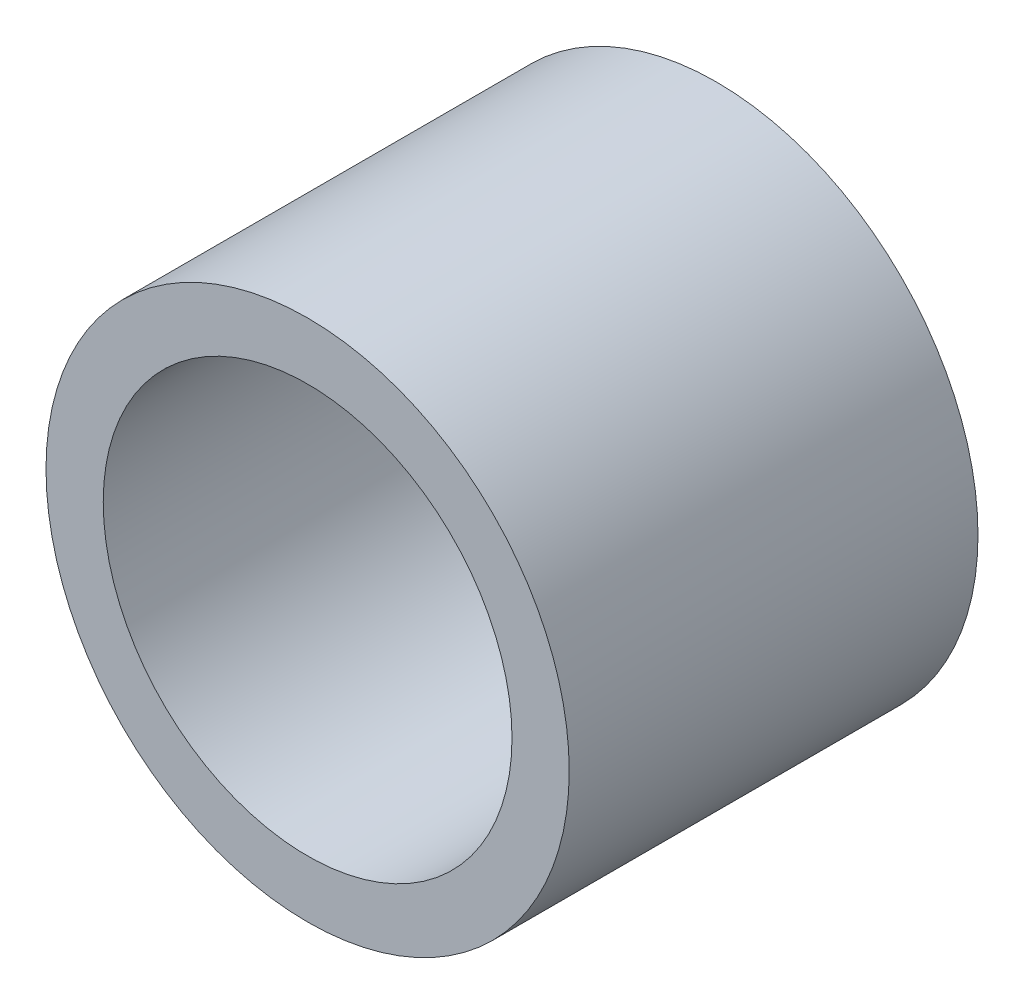
ISO-10303-21;
HEADER;
FILE_DESCRIPTION(('STEP AP214'),'2;1');
FILE_NAME('part.step','',(''),(''),'','','');
FILE_SCHEMA(('AUTOMOTIVE_DESIGN { 1 0 10303 214 1 1 1 1 }'));
ENDSEC;
DATA;
#1=APPLICATION_CONTEXT('core data for automotive mechanical design processes');
#2=APPLICATION_PROTOCOL_DEFINITION('international standard','automotive_design',2000,#1);
#3=PRODUCT_CONTEXT('',#1,'mechanical');
#4=PRODUCT('Part','Part','',(#3));
#5=PRODUCT_RELATED_PRODUCT_CATEGORY('part','',(#4));
#6=PRODUCT_DEFINITION_FORMATION('','',#4);
#7=PRODUCT_DEFINITION_CONTEXT('part definition',#1,'design');
#8=PRODUCT_DEFINITION('design','',#6,#7);
#9=PRODUCT_DEFINITION_SHAPE('','',#8);
#10=(LENGTH_UNIT() NAMED_UNIT(*) SI_UNIT(.MILLI.,.METRE.));
#11=(NAMED_UNIT(*) PLANE_ANGLE_UNIT() SI_UNIT($,.RADIAN.));
#12=(NAMED_UNIT(*) SI_UNIT($,.STERADIAN.) SOLID_ANGLE_UNIT());
#13=UNCERTAINTY_MEASURE_WITH_UNIT(LENGTH_MEASURE(1.E-05),#10,'distance_accuracy_value','');
#14=(GEOMETRIC_REPRESENTATION_CONTEXT(3) GLOBAL_UNCERTAINTY_ASSIGNED_CONTEXT((#13)) GLOBAL_UNIT_ASSIGNED_CONTEXT((#10,
#11,#12)) REPRESENTATION_CONTEXT('',''));
#15=CARTESIAN_POINT('',(0.,0.,0.));
#16=DIRECTION('',(0.,0.,1.));
#17=DIRECTION('',(1.,0.,0.));
#18=AXIS2_PLACEMENT_3D('',#15,#16,#17);
#19=CARTESIAN_POINT('',(0.,0.,6.35));
#20=DIRECTION('',(0.,0.,1.));
#21=DIRECTION('',(1.,0.,0.));
#22=AXIS2_PLACEMENT_3D('',#19,#20,#21);
#23=PLANE('',#22);
#24=CARTESIAN_POINT('',(0.,0.,6.35));
#25=DIRECTION('',(0.,0.,1.));
#26=DIRECTION('',(1.,0.,0.));
#27=AXIS2_PLACEMENT_3D('',#24,#25,#26);
#28=CIRCLE('',#27,4.064);
#29=CARTESIAN_POINT('',(4.064,0.,6.35));
#30=VERTEX_POINT('',#29);
#31=EDGE_CURVE('E10',#30,#30,#28,.T.);
#32=ORIENTED_EDGE('',*,*,#31,.T.);
#33=EDGE_LOOP('',(#32));
#34=FACE_BOUND('',#33,.T.);
#35=CARTESIAN_POINT('',(0.,0.,6.35));
#36=DIRECTION('',(0.,0.,1.));
#37=DIRECTION('',(1.,0.,0.));
#38=AXIS2_PLACEMENT_3D('',#35,#36,#37);
#39=CIRCLE('',#38,3.175);
#40=CARTESIAN_POINT('',(3.175,0.,6.35));
#41=VERTEX_POINT('',#40);
#42=EDGE_CURVE('E40',#41,#41,#39,.T.);
#43=ORIENTED_EDGE('',*,*,#42,.F.);
#44=EDGE_LOOP('',(#43));
#45=FACE_BOUND('',#44,.T.);
#46=ADVANCED_FACE('F29',(#34,#45),#23,.T.);
#47=CARTESIAN_POINT('',(0.,0.,0.));
#48=DIRECTION('',(0.,0.,1.));
#49=DIRECTION('',(1.,0.,0.));
#50=AXIS2_PLACEMENT_3D('',#47,#48,#49);
#51=PLANE('',#50);
#52=CARTESIAN_POINT('',(0.,0.,0.));
#53=DIRECTION('',(0.,0.,1.));
#54=DIRECTION('',(1.,0.,0.));
#55=AXIS2_PLACEMENT_3D('',#52,#53,#54);
#56=CIRCLE('',#55,4.064);
#57=CARTESIAN_POINT('',(4.064,0.,0.));
#58=VERTEX_POINT('',#57);
#59=EDGE_CURVE('E33',#58,#58,#56,.T.);
#60=ORIENTED_EDGE('',*,*,#59,.F.);
#61=EDGE_LOOP('',(#60));
#62=FACE_BOUND('',#61,.T.);
#63=CARTESIAN_POINT('',(0.,0.,0.));
#64=DIRECTION('',(0.,0.,1.));
#65=DIRECTION('',(1.,0.,0.));
#66=AXIS2_PLACEMENT_3D('',#63,#64,#65);
#67=CIRCLE('',#66,3.175);
#68=CARTESIAN_POINT('',(3.175,0.,0.));
#69=VERTEX_POINT('',#68);
#70=EDGE_CURVE('E42',#69,#69,#67,.T.);
#71=ORIENTED_EDGE('',*,*,#70,.T.);
#72=EDGE_LOOP('',(#71));
#73=FACE_BOUND('',#72,.T.);
#74=ADVANCED_FACE('F52',(#62,#73),#51,.F.);
#75=CARTESIAN_POINT('',(0.,0.,6.35));
#76=DIRECTION('',(0.,0.,-1.));
#77=DIRECTION('',(-1.,0.,0.));
#78=AXIS2_PLACEMENT_3D('',#75,#76,#77);
#79=CYLINDRICAL_SURFACE('',#78,4.064);
#80=ORIENTED_EDGE('',*,*,#31,.F.);
#81=EDGE_LOOP('',(#80));
#82=FACE_BOUND('',#81,.T.);
#83=ORIENTED_EDGE('',*,*,#59,.T.);
#84=EDGE_LOOP('',(#83));
#85=FACE_BOUND('',#84,.T.);
#86=ADVANCED_FACE('F31',(#82,#85),#79,.T.);
#87=CARTESIAN_POINT('',(0.,0.,6.35));
#88=DIRECTION('',(0.,0.,-1.));
#89=DIRECTION('',(-1.,0.,0.));
#90=AXIS2_PLACEMENT_3D('',#87,#88,#89);
#91=CYLINDRICAL_SURFACE('',#90,3.175);
#92=ORIENTED_EDGE('',*,*,#42,.T.);
#93=EDGE_LOOP('',(#92));
#94=FACE_BOUND('',#93,.T.);
#95=ORIENTED_EDGE('',*,*,#70,.F.);
#96=EDGE_LOOP('',(#95));
#97=FACE_BOUND('',#96,.T.);
#98=ADVANCED_FACE('F48',(#94,#97),#91,.F.);
#99=CLOSED_SHELL('',(#46,#74,#86,#98));
#100=MANIFOLD_SOLID_BREP('B2',#99);
#101=ADVANCED_BREP_SHAPE_REPRESENTATION('',(#18,#100),#14);
#102=SHAPE_DEFINITION_REPRESENTATION(#9,#101);
ENDSEC;
END-ISO-10303-21;
